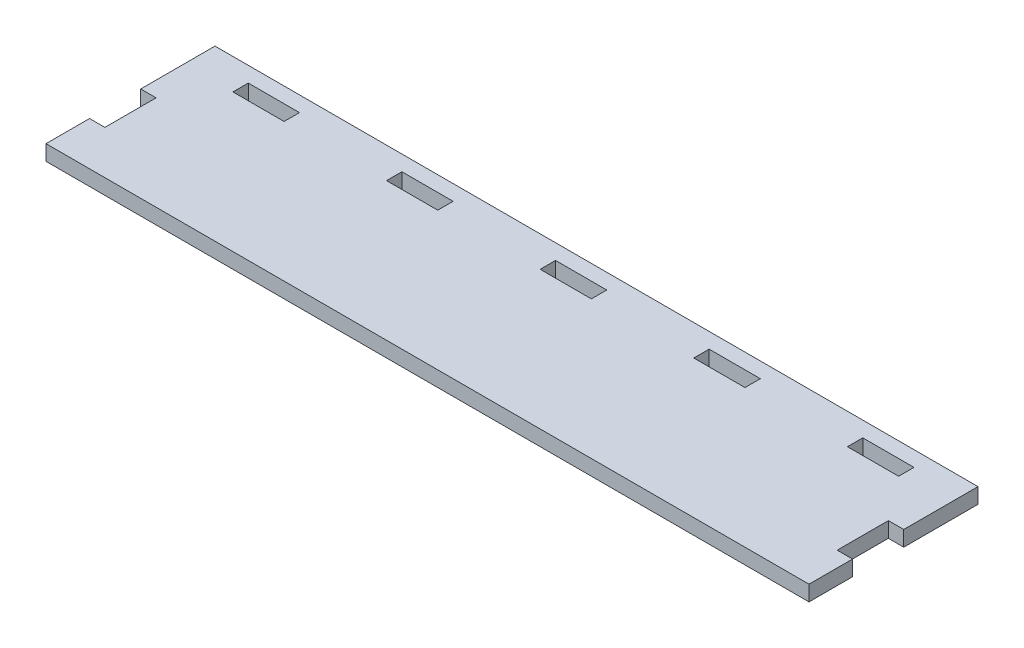
ISO-10303-21;
HEADER;
FILE_DESCRIPTION(('STEP AP214'),'2;1');
FILE_NAME('part.step','',(''),(''),'','','');
FILE_SCHEMA(('AUTOMOTIVE_DESIGN { 1 0 10303 214 1 1 1 1 }'));
ENDSEC;
DATA;
#1=APPLICATION_CONTEXT('core data for automotive mechanical design processes');
#2=APPLICATION_PROTOCOL_DEFINITION('international standard','automotive_design',2000,#1);
#3=PRODUCT_CONTEXT('',#1,'mechanical');
#4=PRODUCT('Part','Part','',(#3));
#5=PRODUCT_RELATED_PRODUCT_CATEGORY('part','',(#4));
#6=PRODUCT_DEFINITION_FORMATION('','',#4);
#7=PRODUCT_DEFINITION_CONTEXT('part definition',#1,'design');
#8=PRODUCT_DEFINITION('design','',#6,#7);
#9=PRODUCT_DEFINITION_SHAPE('','',#8);
#10=(LENGTH_UNIT() NAMED_UNIT(*) SI_UNIT(.MILLI.,.METRE.));
#11=(NAMED_UNIT(*) PLANE_ANGLE_UNIT() SI_UNIT($,.RADIAN.));
#12=(NAMED_UNIT(*) SI_UNIT($,.STERADIAN.) SOLID_ANGLE_UNIT());
#13=UNCERTAINTY_MEASURE_WITH_UNIT(LENGTH_MEASURE(1.E-05),#10,'distance_accuracy_value','');
#14=(GEOMETRIC_REPRESENTATION_CONTEXT(3) GLOBAL_UNCERTAINTY_ASSIGNED_CONTEXT((#13)) GLOBAL_UNIT_ASSIGNED_CONTEXT((#10,
#11,#12)) REPRESENTATION_CONTEXT('',''));
#15=CARTESIAN_POINT('',(0.,0.,0.));
#16=DIRECTION('',(0.,0.,1.));
#17=DIRECTION('',(1.,0.,0.));
#18=AXIS2_PLACEMENT_3D('',#15,#16,#17);
#19=CARTESIAN_POINT('',(0.,3.,0.));
#20=DIRECTION('',(0.,-1.,0.));
#21=DIRECTION('',(0.,0.,-1.));
#22=AXIS2_PLACEMENT_3D('',#19,#20,#21);
#23=PLANE('',#22);
#24=DIRECTION('',(0.,0.,1.));
#25=VECTOR('',#24,1.);
#26=CARTESIAN_POINT('',(55.,3.,3.));
#27=LINE('',#26,#25);
#28=CARTESIAN_POINT('',(55.,3.,3.));
#29=VERTEX_POINT('',#28);
#30=CARTESIAN_POINT('',(55.,3.,6.));
#31=VERTEX_POINT('',#30);
#32=EDGE_CURVE('E278',#29,#31,#27,.T.);
#33=ORIENTED_EDGE('',*,*,#32,.F.);
#34=DIRECTION('',(-1.,0.,0.));
#35=VECTOR('',#34,1.);
#36=CARTESIAN_POINT('',(55.,3.,3.));
#37=LINE('',#36,#35);
#38=CARTESIAN_POINT('',(65.,3.,3.));
#39=VERTEX_POINT('',#38);
#40=EDGE_CURVE('E286',#39,#29,#37,.T.);
#41=ORIENTED_EDGE('',*,*,#40,.F.);
#42=DIRECTION('',(0.,0.,-1.));
#43=VECTOR('',#42,1.);
#44=CARTESIAN_POINT('',(65.,3.,3.));
#45=LINE('',#44,#43);
#46=CARTESIAN_POINT('',(65.,3.,6.));
#47=VERTEX_POINT('',#46);
#48=EDGE_CURVE('E283',#47,#39,#45,.T.);
#49=ORIENTED_EDGE('',*,*,#48,.F.);
#50=DIRECTION('',(1.,0.,0.));
#51=VECTOR('',#50,1.);
#52=CARTESIAN_POINT('',(55.,3.,6.));
#53=LINE('',#52,#51);
#54=EDGE_CURVE('E280',#31,#47,#53,.T.);
#55=ORIENTED_EDGE('',*,*,#54,.F.);
#56=EDGE_LOOP('',(#33,#41,#49,#55));
#57=FACE_BOUND('',#56,.T.);
#58=DIRECTION('',(-1.,0.,0.));
#59=VECTOR('',#58,1.);
#60=CARTESIAN_POINT('',(-55.,3.,3.));
#61=LINE('',#60,#59);
#62=CARTESIAN_POINT('',(-55.,3.,3.));
#63=VERTEX_POINT('',#62);
#64=CARTESIAN_POINT('',(-65.,3.,3.));
#65=VERTEX_POINT('',#64);
#66=EDGE_CURVE('E340',#63,#65,#61,.T.);
#67=ORIENTED_EDGE('',*,*,#66,.F.);
#68=DIRECTION('',(0.,0.,-1.));
#69=VECTOR('',#68,1.);
#70=CARTESIAN_POINT('',(-55.,3.,3.));
#71=LINE('',#70,#69);
#72=CARTESIAN_POINT('',(-55.,3.,6.));
#73=VERTEX_POINT('',#72);
#74=EDGE_CURVE('E348',#73,#63,#71,.T.);
#75=ORIENTED_EDGE('',*,*,#74,.F.);
#76=DIRECTION('',(1.,0.,0.));
#77=VECTOR('',#76,1.);
#78=CARTESIAN_POINT('',(-55.,3.,6.));
#79=LINE('',#78,#77);
#80=CARTESIAN_POINT('',(-65.,3.,6.));
#81=VERTEX_POINT('',#80);
#82=EDGE_CURVE('E345',#81,#73,#79,.T.);
#83=ORIENTED_EDGE('',*,*,#82,.F.);
#84=DIRECTION('',(0.,0.,1.));
#85=VECTOR('',#84,1.);
#86=CARTESIAN_POINT('',(-65.,3.,3.));
#87=LINE('',#86,#85);
#88=EDGE_CURVE('E342',#65,#81,#87,.T.);
#89=ORIENTED_EDGE('',*,*,#88,.F.);
#90=EDGE_LOOP('',(#67,#75,#83,#89));
#91=FACE_BOUND('',#90,.T.);
#92=DIRECTION('',(0.,0.,1.));
#93=VECTOR('',#92,1.);
#94=CARTESIAN_POINT('',(-74.5,3.,0.));
#95=LINE('',#94,#93);
#96=CARTESIAN_POINT('',(-74.5,3.,0.));
#97=VERTEX_POINT('',#96);
#98=CARTESIAN_POINT('',(-74.5,3.,14.5));
#99=VERTEX_POINT('',#98);
#100=EDGE_CURVE('E402',#97,#99,#95,.T.);
#101=ORIENTED_EDGE('',*,*,#100,.T.);
#102=DIRECTION('',(1.,0.,0.));
#103=VECTOR('',#102,1.);
#104=CARTESIAN_POINT('',(-71.5,3.,14.5));
#105=LINE('',#104,#103);
#106=CARTESIAN_POINT('',(-71.5,3.,14.5));
#107=VERTEX_POINT('',#106);
#108=EDGE_CURVE('E405',#99,#107,#105,.T.);
#109=ORIENTED_EDGE('',*,*,#108,.T.);
#110=DIRECTION('',(0.,0.,1.));
#111=VECTOR('',#110,1.);
#112=CARTESIAN_POINT('',(-71.5,3.,14.5));
#113=LINE('',#112,#111);
#114=CARTESIAN_POINT('',(-71.5,3.,24.5));
#115=VERTEX_POINT('',#114);
#116=EDGE_CURVE('E408',#107,#115,#113,.T.);
#117=ORIENTED_EDGE('',*,*,#116,.T.);
#118=DIRECTION('',(-1.,0.,0.));
#119=VECTOR('',#118,1.);
#120=CARTESIAN_POINT('',(-71.5,3.,24.5));
#121=LINE('',#120,#119);
#122=CARTESIAN_POINT('',(-74.5,3.,24.5));
#123=VERTEX_POINT('',#122);
#124=EDGE_CURVE('E410',#115,#123,#121,.T.);
#125=ORIENTED_EDGE('',*,*,#124,.T.);
#126=DIRECTION('',(0.,0.,1.));
#127=VECTOR('',#126,1.);
#128=CARTESIAN_POINT('',(-74.5,3.,24.5));
#129=LINE('',#128,#127);
#130=CARTESIAN_POINT('',(-74.5,3.,33.));
#131=VERTEX_POINT('',#130);
#132=EDGE_CURVE('E412',#123,#131,#129,.T.);
#133=ORIENTED_EDGE('',*,*,#132,.T.);
#134=DIRECTION('',(1.,0.,0.));
#135=VECTOR('',#134,1.);
#136=CARTESIAN_POINT('',(-74.5,3.,33.));
#137=LINE('',#136,#135);
#138=CARTESIAN_POINT('',(74.5,3.,33.));
#139=VERTEX_POINT('',#138);
#140=EDGE_CURVE('E414',#131,#139,#137,.T.);
#141=ORIENTED_EDGE('',*,*,#140,.T.);
#142=DIRECTION('',(0.,0.,-1.));
#143=VECTOR('',#142,1.);
#144=CARTESIAN_POINT('',(74.5,3.,24.5));
#145=LINE('',#144,#143);
#146=CARTESIAN_POINT('',(74.5,3.,24.5));
#147=VERTEX_POINT('',#146);
#148=EDGE_CURVE('E416',#139,#147,#145,.T.);
#149=ORIENTED_EDGE('',*,*,#148,.T.);
#150=DIRECTION('',(-1.,0.,0.));
#151=VECTOR('',#150,1.);
#152=CARTESIAN_POINT('',(71.5,3.,24.5));
#153=LINE('',#152,#151);
#154=CARTESIAN_POINT('',(71.5,3.,24.5));
#155=VERTEX_POINT('',#154);
#156=EDGE_CURVE('E418',#147,#155,#153,.T.);
#157=ORIENTED_EDGE('',*,*,#156,.T.);
#158=DIRECTION('',(0.,0.,-1.));
#159=VECTOR('',#158,1.);
#160=CARTESIAN_POINT('',(71.5,3.,14.5));
#161=LINE('',#160,#159);
#162=CARTESIAN_POINT('',(71.5,3.,14.5));
#163=VERTEX_POINT('',#162);
#164=EDGE_CURVE('E420',#155,#163,#161,.T.);
#165=ORIENTED_EDGE('',*,*,#164,.T.);
#166=DIRECTION('',(1.,0.,0.));
#167=VECTOR('',#166,1.);
#168=CARTESIAN_POINT('',(71.5,3.,14.5));
#169=LINE('',#168,#167);
#170=CARTESIAN_POINT('',(74.5,3.,14.5));
#171=VERTEX_POINT('',#170);
#172=EDGE_CURVE('E422',#163,#171,#169,.T.);
#173=ORIENTED_EDGE('',*,*,#172,.T.);
#174=DIRECTION('',(0.,0.,-1.));
#175=VECTOR('',#174,1.);
#176=CARTESIAN_POINT('',(74.5,3.,0.));
#177=LINE('',#176,#175);
#178=CARTESIAN_POINT('',(74.5,3.,0.));
#179=VERTEX_POINT('',#178);
#180=EDGE_CURVE('E424',#171,#179,#177,.T.);
#181=ORIENTED_EDGE('',*,*,#180,.T.);
#182=DIRECTION('',(-1.,0.,0.));
#183=VECTOR('',#182,1.);
#184=CARTESIAN_POINT('',(-74.5,3.,0.));
#185=LINE('',#184,#183);
#186=EDGE_CURVE('E426',#179,#97,#185,.T.);
#187=ORIENTED_EDGE('',*,*,#186,.T.);
#188=EDGE_LOOP('',(#101,#109,#117,#125,#133,#141,#149,#157,#165,#173,#181,#187));
#189=FACE_BOUND('',#188,.T.);
#190=DIRECTION('',(0.,0.,1.));
#191=VECTOR('',#190,1.);
#192=CARTESIAN_POINT('',(-5.,3.,3.));
#193=LINE('',#192,#191);
#194=CARTESIAN_POINT('',(-5.,3.,3.));
#195=VERTEX_POINT('',#194);
#196=CARTESIAN_POINT('',(-5.,3.,6.));
#197=VERTEX_POINT('',#196);
#198=EDGE_CURVE('E371',#195,#197,#193,.T.);
#199=ORIENTED_EDGE('',*,*,#198,.F.);
#200=DIRECTION('',(-1.,0.,0.));
#201=VECTOR('',#200,1.);
#202=CARTESIAN_POINT('',(-5.,3.,3.));
#203=LINE('',#202,#201);
#204=CARTESIAN_POINT('',(5.,3.,3.));
#205=VERTEX_POINT('',#204);
#206=EDGE_CURVE('E379',#205,#195,#203,.T.);
#207=ORIENTED_EDGE('',*,*,#206,.F.);
#208=DIRECTION('',(0.,0.,-1.));
#209=VECTOR('',#208,1.);
#210=CARTESIAN_POINT('',(5.,3.,3.));
#211=LINE('',#210,#209);
#212=CARTESIAN_POINT('',(5.,3.,6.));
#213=VERTEX_POINT('',#212);
#214=EDGE_CURVE('E376',#213,#205,#211,.T.);
#215=ORIENTED_EDGE('',*,*,#214,.F.);
#216=DIRECTION('',(1.,0.,0.));
#217=VECTOR('',#216,1.);
#218=CARTESIAN_POINT('',(-5.,3.,6.));
#219=LINE('',#218,#217);
#220=EDGE_CURVE('E373',#197,#213,#219,.T.);
#221=ORIENTED_EDGE('',*,*,#220,.F.);
#222=EDGE_LOOP('',(#199,#207,#215,#221));
#223=FACE_BOUND('',#222,.T.);
#224=DIRECTION('',(0.,0.,1.));
#225=VECTOR('',#224,1.);
#226=CARTESIAN_POINT('',(25.,3.,3.));
#227=LINE('',#226,#225);
#228=CARTESIAN_POINT('',(25.,3.,3.));
#229=VERTEX_POINT('',#228);
#230=CARTESIAN_POINT('',(25.,3.,6.));
#231=VERTEX_POINT('',#230);
#232=EDGE_CURVE('E309',#229,#231,#227,.T.);
#233=ORIENTED_EDGE('',*,*,#232,.F.);
#234=DIRECTION('',(-1.,0.,0.));
#235=VECTOR('',#234,1.);
#236=CARTESIAN_POINT('',(25.,3.,3.));
#237=LINE('',#236,#235);
#238=CARTESIAN_POINT('',(35.,3.,3.));
#239=VERTEX_POINT('',#238);
#240=EDGE_CURVE('E317',#239,#229,#237,.T.);
#241=ORIENTED_EDGE('',*,*,#240,.F.);
#242=DIRECTION('',(0.,0.,-1.));
#243=VECTOR('',#242,1.);
#244=CARTESIAN_POINT('',(35.,3.,3.));
#245=LINE('',#244,#243);
#246=CARTESIAN_POINT('',(35.,3.,6.));
#247=VERTEX_POINT('',#246);
#248=EDGE_CURVE('E314',#247,#239,#245,.T.);
#249=ORIENTED_EDGE('',*,*,#248,.F.);
#250=DIRECTION('',(1.,0.,0.));
#251=VECTOR('',#250,1.);
#252=CARTESIAN_POINT('',(25.,3.,6.));
#253=LINE('',#252,#251);
#254=EDGE_CURVE('E311',#231,#247,#253,.T.);
#255=ORIENTED_EDGE('',*,*,#254,.F.);
#256=EDGE_LOOP('',(#233,#241,#249,#255));
#257=FACE_BOUND('',#256,.T.);
#258=DIRECTION('',(-1.,0.,0.));
#259=VECTOR('',#258,1.);
#260=CARTESIAN_POINT('',(-25.,3.,3.));
#261=LINE('',#260,#259);
#262=CARTESIAN_POINT('',(-25.,3.,3.));
#263=VERTEX_POINT('',#262);
#264=CARTESIAN_POINT('',(-35.,3.,3.));
#265=VERTEX_POINT('',#264);
#266=EDGE_CURVE('E242',#263,#265,#261,.T.);
#267=ORIENTED_EDGE('',*,*,#266,.F.);
#268=DIRECTION('',(0.,0.,-1.));
#269=VECTOR('',#268,1.);
#270=CARTESIAN_POINT('',(-25.,3.,3.));
#271=LINE('',#270,#269);
#272=CARTESIAN_POINT('',(-25.,3.,6.));
#273=VERTEX_POINT('',#272);
#274=EDGE_CURVE('E264',#273,#263,#271,.T.);
#275=ORIENTED_EDGE('',*,*,#274,.F.);
#276=DIRECTION('',(1.,0.,0.));
#277=VECTOR('',#276,1.);
#278=CARTESIAN_POINT('',(-25.,3.,6.));
#279=LINE('',#278,#277);
#280=CARTESIAN_POINT('',(-35.,3.,6.));
#281=VERTEX_POINT('',#280);
#282=EDGE_CURVE('E262',#281,#273,#279,.T.);
#283=ORIENTED_EDGE('',*,*,#282,.F.);
#284=DIRECTION('',(0.,0.,1.));
#285=VECTOR('',#284,1.);
#286=CARTESIAN_POINT('',(-35.,3.,3.));
#287=LINE('',#286,#285);
#288=EDGE_CURVE('E250',#265,#281,#287,.T.);
#289=ORIENTED_EDGE('',*,*,#288,.F.);
#290=EDGE_LOOP('',(#267,#275,#283,#289));
#291=FACE_BOUND('',#290,.T.);
#292=ADVANCED_FACE('F33',(#57,#91,#189,#223,#257,#291),#23,.F.);
#293=CARTESIAN_POINT('',(0.,0.,0.));
#294=DIRECTION('',(0.,-1.,0.));
#295=DIRECTION('',(0.,0.,-1.));
#296=AXIS2_PLACEMENT_3D('',#293,#294,#295);
#297=PLANE('',#296);
#298=DIRECTION('',(0.,0.,1.));
#299=VECTOR('',#298,1.);
#300=CARTESIAN_POINT('',(-74.5,0.,0.));
#301=LINE('',#300,#299);
#302=CARTESIAN_POINT('',(-74.5,0.,0.));
#303=VERTEX_POINT('',#302);
#304=CARTESIAN_POINT('',(-74.5,0.,14.5));
#305=VERTEX_POINT('',#304);
#306=EDGE_CURVE('E401',#303,#305,#301,.T.);
#307=ORIENTED_EDGE('',*,*,#306,.F.);
#308=DIRECTION('',(-1.,0.,0.));
#309=VECTOR('',#308,1.);
#310=CARTESIAN_POINT('',(-74.5,0.,0.));
#311=LINE('',#310,#309);
#312=CARTESIAN_POINT('',(74.5,0.,0.));
#313=VERTEX_POINT('',#312);
#314=EDGE_CURVE('E406',#313,#303,#311,.T.);
#315=ORIENTED_EDGE('',*,*,#314,.F.);
#316=DIRECTION('',(0.,0.,-1.));
#317=VECTOR('',#316,1.);
#318=CARTESIAN_POINT('',(74.5,0.,0.));
#319=LINE('',#318,#317);
#320=CARTESIAN_POINT('',(74.5,0.,14.5));
#321=VERTEX_POINT('',#320);
#322=EDGE_CURVE('E449',#321,#313,#319,.T.);
#323=ORIENTED_EDGE('',*,*,#322,.F.);
#324=DIRECTION('',(1.,0.,0.));
#325=VECTOR('',#324,1.);
#326=CARTESIAN_POINT('',(71.5,0.,14.5));
#327=LINE('',#326,#325);
#328=CARTESIAN_POINT('',(71.5,0.,14.5));
#329=VERTEX_POINT('',#328);
#330=EDGE_CURVE('E447',#329,#321,#327,.T.);
#331=ORIENTED_EDGE('',*,*,#330,.F.);
#332=DIRECTION('',(0.,0.,-1.));
#333=VECTOR('',#332,1.);
#334=CARTESIAN_POINT('',(71.5,0.,14.5));
#335=LINE('',#334,#333);
#336=CARTESIAN_POINT('',(71.5,0.,24.5));
#337=VERTEX_POINT('',#336);
#338=EDGE_CURVE('E445',#337,#329,#335,.T.);
#339=ORIENTED_EDGE('',*,*,#338,.F.);
#340=DIRECTION('',(-1.,0.,0.));
#341=VECTOR('',#340,1.);
#342=CARTESIAN_POINT('',(71.5,0.,24.5));
#343=LINE('',#342,#341);
#344=CARTESIAN_POINT('',(74.5,0.,24.5));
#345=VERTEX_POINT('',#344);
#346=EDGE_CURVE('E443',#345,#337,#343,.T.);
#347=ORIENTED_EDGE('',*,*,#346,.F.);
#348=DIRECTION('',(0.,0.,-1.));
#349=VECTOR('',#348,1.);
#350=CARTESIAN_POINT('',(74.5,0.,24.5));
#351=LINE('',#350,#349);
#352=CARTESIAN_POINT('',(74.5,0.,33.));
#353=VERTEX_POINT('',#352);
#354=EDGE_CURVE('E441',#353,#345,#351,.T.);
#355=ORIENTED_EDGE('',*,*,#354,.F.);
#356=DIRECTION('',(1.,0.,0.));
#357=VECTOR('',#356,1.);
#358=CARTESIAN_POINT('',(-74.5,0.,33.));
#359=LINE('',#358,#357);
#360=CARTESIAN_POINT('',(-74.5,0.,33.));
#361=VERTEX_POINT('',#360);
#362=EDGE_CURVE('E439',#361,#353,#359,.T.);
#363=ORIENTED_EDGE('',*,*,#362,.F.);
#364=DIRECTION('',(0.,0.,1.));
#365=VECTOR('',#364,1.);
#366=CARTESIAN_POINT('',(-74.5,0.,24.5));
#367=LINE('',#366,#365);
#368=CARTESIAN_POINT('',(-74.5,0.,24.5));
#369=VERTEX_POINT('',#368);
#370=EDGE_CURVE('E437',#369,#361,#367,.T.);
#371=ORIENTED_EDGE('',*,*,#370,.F.);
#372=DIRECTION('',(-1.,0.,0.));
#373=VECTOR('',#372,1.);
#374=CARTESIAN_POINT('',(-71.5,0.,24.5));
#375=LINE('',#374,#373);
#376=CARTESIAN_POINT('',(-71.5,0.,24.5));
#377=VERTEX_POINT('',#376);
#378=EDGE_CURVE('E435',#377,#369,#375,.T.);
#379=ORIENTED_EDGE('',*,*,#378,.F.);
#380=DIRECTION('',(0.,0.,1.));
#381=VECTOR('',#380,1.);
#382=CARTESIAN_POINT('',(-71.5,0.,14.5));
#383=LINE('',#382,#381);
#384=CARTESIAN_POINT('',(-71.5,0.,14.5));
#385=VERTEX_POINT('',#384);
#386=EDGE_CURVE('E433',#385,#377,#383,.T.);
#387=ORIENTED_EDGE('',*,*,#386,.F.);
#388=DIRECTION('',(1.,0.,0.));
#389=VECTOR('',#388,1.);
#390=CARTESIAN_POINT('',(-71.5,0.,14.5));
#391=LINE('',#390,#389);
#392=EDGE_CURVE('E431',#305,#385,#391,.T.);
#393=ORIENTED_EDGE('',*,*,#392,.F.);
#394=EDGE_LOOP('',(#307,#315,#323,#331,#339,#347,#355,#363,#371,#379,#387,#393));
#395=FACE_BOUND('',#394,.T.);
#396=DIRECTION('',(-1.,0.,0.));
#397=VECTOR('',#396,1.);
#398=CARTESIAN_POINT('',(-5.,0.,3.));
#399=LINE('',#398,#397);
#400=CARTESIAN_POINT('',(5.,0.,3.));
#401=VERTEX_POINT('',#400);
#402=CARTESIAN_POINT('',(-5.,0.,3.));
#403=VERTEX_POINT('',#402);
#404=EDGE_CURVE('E374',#401,#403,#399,.T.);
#405=ORIENTED_EDGE('',*,*,#404,.T.);
#406=DIRECTION('',(0.,0.,1.));
#407=VECTOR('',#406,1.);
#408=CARTESIAN_POINT('',(-5.,0.,3.));
#409=LINE('',#408,#407);
#410=CARTESIAN_POINT('',(-5.,0.,6.));
#411=VERTEX_POINT('',#410);
#412=EDGE_CURVE('E370',#403,#411,#409,.T.);
#413=ORIENTED_EDGE('',*,*,#412,.T.);
#414=DIRECTION('',(1.,0.,0.));
#415=VECTOR('',#414,1.);
#416=CARTESIAN_POINT('',(-5.,0.,6.));
#417=LINE('',#416,#415);
#418=CARTESIAN_POINT('',(5.,0.,6.));
#419=VERTEX_POINT('',#418);
#420=EDGE_CURVE('E384',#411,#419,#417,.T.);
#421=ORIENTED_EDGE('',*,*,#420,.T.);
#422=DIRECTION('',(0.,0.,-1.));
#423=VECTOR('',#422,1.);
#424=CARTESIAN_POINT('',(5.,0.,3.));
#425=LINE('',#424,#423);
#426=EDGE_CURVE('E387',#419,#401,#425,.T.);
#427=ORIENTED_EDGE('',*,*,#426,.T.);
#428=EDGE_LOOP('',(#405,#413,#421,#427));
#429=FACE_BOUND('',#428,.T.);
#430=DIRECTION('',(0.,0.,-1.));
#431=VECTOR('',#430,1.);
#432=CARTESIAN_POINT('',(-55.,0.,3.));
#433=LINE('',#432,#431);
#434=CARTESIAN_POINT('',(-55.,0.,6.));
#435=VERTEX_POINT('',#434);
#436=CARTESIAN_POINT('',(-55.,0.,3.));
#437=VERTEX_POINT('',#436);
#438=EDGE_CURVE('E343',#435,#437,#433,.T.);
#439=ORIENTED_EDGE('',*,*,#438,.T.);
#440=DIRECTION('',(-1.,0.,0.));
#441=VECTOR('',#440,1.);
#442=CARTESIAN_POINT('',(-55.,0.,3.));
#443=LINE('',#442,#441);
#444=CARTESIAN_POINT('',(-65.,0.,3.));
#445=VERTEX_POINT('',#444);
#446=EDGE_CURVE('E339',#437,#445,#443,.T.);
#447=ORIENTED_EDGE('',*,*,#446,.T.);
#448=DIRECTION('',(0.,0.,1.));
#449=VECTOR('',#448,1.);
#450=CARTESIAN_POINT('',(-65.,0.,3.));
#451=LINE('',#450,#449);
#452=CARTESIAN_POINT('',(-65.,0.,6.));
#453=VERTEX_POINT('',#452);
#454=EDGE_CURVE('E353',#445,#453,#451,.T.);
#455=ORIENTED_EDGE('',*,*,#454,.T.);
#456=DIRECTION('',(1.,0.,0.));
#457=VECTOR('',#456,1.);
#458=CARTESIAN_POINT('',(-55.,0.,6.));
#459=LINE('',#458,#457);
#460=EDGE_CURVE('E356',#453,#435,#459,.T.);
#461=ORIENTED_EDGE('',*,*,#460,.T.);
#462=EDGE_LOOP('',(#439,#447,#455,#461));
#463=FACE_BOUND('',#462,.T.);
#464=DIRECTION('',(-1.,0.,0.));
#465=VECTOR('',#464,1.);
#466=CARTESIAN_POINT('',(25.,0.,3.));
#467=LINE('',#466,#465);
#468=CARTESIAN_POINT('',(35.,0.,3.));
#469=VERTEX_POINT('',#468);
#470=CARTESIAN_POINT('',(25.,0.,3.));
#471=VERTEX_POINT('',#470);
#472=EDGE_CURVE('E312',#469,#471,#467,.T.);
#473=ORIENTED_EDGE('',*,*,#472,.T.);
#474=DIRECTION('',(0.,0.,1.));
#475=VECTOR('',#474,1.);
#476=CARTESIAN_POINT('',(25.,0.,3.));
#477=LINE('',#476,#475);
#478=CARTESIAN_POINT('',(25.,0.,6.));
#479=VERTEX_POINT('',#478);
#480=EDGE_CURVE('E308',#471,#479,#477,.T.);
#481=ORIENTED_EDGE('',*,*,#480,.T.);
#482=DIRECTION('',(1.,0.,0.));
#483=VECTOR('',#482,1.);
#484=CARTESIAN_POINT('',(25.,0.,6.));
#485=LINE('',#484,#483);
#486=CARTESIAN_POINT('',(35.,0.,6.));
#487=VERTEX_POINT('',#486);
#488=EDGE_CURVE('E322',#479,#487,#485,.T.);
#489=ORIENTED_EDGE('',*,*,#488,.T.);
#490=DIRECTION('',(0.,0.,-1.));
#491=VECTOR('',#490,1.);
#492=CARTESIAN_POINT('',(35.,0.,3.));
#493=LINE('',#492,#491);
#494=EDGE_CURVE('E325',#487,#469,#493,.T.);
#495=ORIENTED_EDGE('',*,*,#494,.T.);
#496=EDGE_LOOP('',(#473,#481,#489,#495));
#497=FACE_BOUND('',#496,.T.);
#498=DIRECTION('',(-1.,0.,0.));
#499=VECTOR('',#498,1.);
#500=CARTESIAN_POINT('',(55.,0.,3.));
#501=LINE('',#500,#499);
#502=CARTESIAN_POINT('',(65.,0.,3.));
#503=VERTEX_POINT('',#502);
#504=CARTESIAN_POINT('',(55.,0.,3.));
#505=VERTEX_POINT('',#504);
#506=EDGE_CURVE('E281',#503,#505,#501,.T.);
#507=ORIENTED_EDGE('',*,*,#506,.T.);
#508=DIRECTION('',(0.,0.,1.));
#509=VECTOR('',#508,1.);
#510=CARTESIAN_POINT('',(55.,0.,3.));
#511=LINE('',#510,#509);
#512=CARTESIAN_POINT('',(55.,0.,6.));
#513=VERTEX_POINT('',#512);
#514=EDGE_CURVE('E258',#505,#513,#511,.T.);
#515=ORIENTED_EDGE('',*,*,#514,.T.);
#516=DIRECTION('',(1.,0.,0.));
#517=VECTOR('',#516,1.);
#518=CARTESIAN_POINT('',(55.,0.,6.));
#519=LINE('',#518,#517);
#520=CARTESIAN_POINT('',(65.,0.,6.));
#521=VERTEX_POINT('',#520);
#522=EDGE_CURVE('E291',#513,#521,#519,.T.);
#523=ORIENTED_EDGE('',*,*,#522,.T.);
#524=DIRECTION('',(0.,0.,-1.));
#525=VECTOR('',#524,1.);
#526=CARTESIAN_POINT('',(65.,0.,3.));
#527=LINE('',#526,#525);
#528=EDGE_CURVE('E294',#521,#503,#527,.T.);
#529=ORIENTED_EDGE('',*,*,#528,.T.);
#530=EDGE_LOOP('',(#507,#515,#523,#529));
#531=FACE_BOUND('',#530,.T.);
#532=DIRECTION('',(0.,0.,-1.));
#533=VECTOR('',#532,1.);
#534=CARTESIAN_POINT('',(-25.,0.,3.));
#535=LINE('',#534,#533);
#536=CARTESIAN_POINT('',(-25.,0.,6.));
#537=VERTEX_POINT('',#536);
#538=CARTESIAN_POINT('',(-25.,0.,3.));
#539=VERTEX_POINT('',#538);
#540=EDGE_CURVE('E251',#537,#539,#535,.T.);
#541=ORIENTED_EDGE('',*,*,#540,.T.);
#542=DIRECTION('',(-1.,0.,0.));
#543=VECTOR('',#542,1.);
#544=CARTESIAN_POINT('',(-25.,0.,3.));
#545=LINE('',#544,#543);
#546=CARTESIAN_POINT('',(-35.,0.,3.));
#547=VERTEX_POINT('',#546);
#548=EDGE_CURVE('E56',#539,#547,#545,.T.);
#549=ORIENTED_EDGE('',*,*,#548,.T.);
#550=DIRECTION('',(0.,0.,1.));
#551=VECTOR('',#550,1.);
#552=CARTESIAN_POINT('',(-35.,0.,3.));
#553=LINE('',#552,#551);
#554=CARTESIAN_POINT('',(-35.,0.,6.));
#555=VERTEX_POINT('',#554);
#556=EDGE_CURVE('E257',#547,#555,#553,.T.);
#557=ORIENTED_EDGE('',*,*,#556,.T.);
#558=DIRECTION('',(1.,0.,0.));
#559=VECTOR('',#558,1.);
#560=CARTESIAN_POINT('',(-25.,0.,6.));
#561=LINE('',#560,#559);
#562=EDGE_CURVE('E270',#555,#537,#561,.T.);
#563=ORIENTED_EDGE('',*,*,#562,.T.);
#564=EDGE_LOOP('',(#541,#549,#557,#563));
#565=FACE_BOUND('',#564,.T.);
#566=ADVANCED_FACE('F491',(#395,#429,#463,#497,#531,#565),#297,.T.);
#567=CARTESIAN_POINT('',(-74.5,3.,0.));
#568=DIRECTION('',(1.,0.,0.));
#569=DIRECTION('',(0.,0.,-1.));
#570=AXIS2_PLACEMENT_3D('',#567,#568,#569);
#571=PLANE('',#570);
#572=ORIENTED_EDGE('',*,*,#306,.T.);
#573=DIRECTION('',(0.,-1.,0.));
#574=VECTOR('',#573,1.);
#575=CARTESIAN_POINT('',(-74.5,3.,14.5));
#576=LINE('',#575,#574);
#577=EDGE_CURVE('E11',#99,#305,#576,.T.);
#578=ORIENTED_EDGE('',*,*,#577,.F.);
#579=ORIENTED_EDGE('',*,*,#100,.F.);
#580=DIRECTION('',(0.,-1.,0.));
#581=VECTOR('',#580,1.);
#582=CARTESIAN_POINT('',(-74.5,3.,0.));
#583=LINE('',#582,#581);
#584=EDGE_CURVE('E428',#97,#303,#583,.T.);
#585=ORIENTED_EDGE('',*,*,#584,.T.);
#586=EDGE_LOOP('',(#572,#578,#579,#585));
#587=FACE_BOUND('',#586,.T.);
#588=ADVANCED_FACE('F35',(#587),#571,.F.);
#589=CARTESIAN_POINT('',(-71.5,3.,14.5));
#590=DIRECTION('',(0.,0.,-1.));
#591=DIRECTION('',(-1.,0.,0.));
#592=AXIS2_PLACEMENT_3D('',#589,#590,#591);
#593=PLANE('',#592);
#594=ORIENTED_EDGE('',*,*,#392,.T.);
#595=DIRECTION('',(0.,-1.,0.));
#596=VECTOR('',#595,1.);
#597=CARTESIAN_POINT('',(-71.5,3.,14.5));
#598=LINE('',#597,#596);
#599=EDGE_CURVE('E41',#107,#385,#598,.T.);
#600=ORIENTED_EDGE('',*,*,#599,.F.);
#601=ORIENTED_EDGE('',*,*,#108,.F.);
#602=ORIENTED_EDGE('',*,*,#577,.T.);
#603=EDGE_LOOP('',(#594,#600,#601,#602));
#604=FACE_BOUND('',#603,.T.);
#605=ADVANCED_FACE('F509',(#604),#593,.F.);
#606=CARTESIAN_POINT('',(-71.5,3.,14.5));
#607=DIRECTION('',(1.,0.,0.));
#608=DIRECTION('',(0.,0.,-1.));
#609=AXIS2_PLACEMENT_3D('',#606,#607,#608);
#610=PLANE('',#609);
#611=ORIENTED_EDGE('',*,*,#386,.T.);
#612=DIRECTION('',(0.,-1.,0.));
#613=VECTOR('',#612,1.);
#614=CARTESIAN_POINT('',(-71.5,3.,24.5));
#615=LINE('',#614,#613);
#616=EDGE_CURVE('E478',#115,#377,#615,.T.);
#617=ORIENTED_EDGE('',*,*,#616,.F.);
#618=ORIENTED_EDGE('',*,*,#116,.F.);
#619=ORIENTED_EDGE('',*,*,#599,.T.);
#620=EDGE_LOOP('',(#611,#617,#618,#619));
#621=FACE_BOUND('',#620,.T.);
#622=ADVANCED_FACE('F485',(#621),#610,.F.);
#623=CARTESIAN_POINT('',(-71.5,3.,24.5));
#624=DIRECTION('',(0.,0.,1.));
#625=DIRECTION('',(1.,0.,0.));
#626=AXIS2_PLACEMENT_3D('',#623,#624,#625);
#627=PLANE('',#626);
#628=ORIENTED_EDGE('',*,*,#378,.T.);
#629=DIRECTION('',(0.,-1.,0.));
#630=VECTOR('',#629,1.);
#631=CARTESIAN_POINT('',(-74.5,3.,24.5));
#632=LINE('',#631,#630);
#633=EDGE_CURVE('E475',#123,#369,#632,.T.);
#634=ORIENTED_EDGE('',*,*,#633,.F.);
#635=ORIENTED_EDGE('',*,*,#124,.F.);
#636=ORIENTED_EDGE('',*,*,#616,.T.);
#637=EDGE_LOOP('',(#628,#634,#635,#636));
#638=FACE_BOUND('',#637,.T.);
#639=ADVANCED_FACE('F497',(#638),#627,.F.);
#640=CARTESIAN_POINT('',(-74.5,3.,24.5));
#641=DIRECTION('',(1.,0.,0.));
#642=DIRECTION('',(0.,0.,-1.));
#643=AXIS2_PLACEMENT_3D('',#640,#641,#642);
#644=PLANE('',#643);
#645=ORIENTED_EDGE('',*,*,#370,.T.);
#646=DIRECTION('',(0.,-1.,0.));
#647=VECTOR('',#646,1.);
#648=CARTESIAN_POINT('',(-74.5,3.,33.));
#649=LINE('',#648,#647);
#650=EDGE_CURVE('E472',#131,#361,#649,.T.);
#651=ORIENTED_EDGE('',*,*,#650,.F.);
#652=ORIENTED_EDGE('',*,*,#132,.F.);
#653=ORIENTED_EDGE('',*,*,#633,.T.);
#654=EDGE_LOOP('',(#645,#651,#652,#653));
#655=FACE_BOUND('',#654,.T.);
#656=ADVANCED_FACE('F501',(#655),#644,.F.);
#657=CARTESIAN_POINT('',(-74.5,3.,33.));
#658=DIRECTION('',(0.,0.,-1.));
#659=DIRECTION('',(-1.,0.,0.));
#660=AXIS2_PLACEMENT_3D('',#657,#658,#659);
#661=PLANE('',#660);
#662=ORIENTED_EDGE('',*,*,#362,.T.);
#663=DIRECTION('',(0.,-1.,0.));
#664=VECTOR('',#663,1.);
#665=CARTESIAN_POINT('',(74.5,3.,33.));
#666=LINE('',#665,#664);
#667=EDGE_CURVE('E469',#139,#353,#666,.T.);
#668=ORIENTED_EDGE('',*,*,#667,.F.);
#669=ORIENTED_EDGE('',*,*,#140,.F.);
#670=ORIENTED_EDGE('',*,*,#650,.T.);
#671=EDGE_LOOP('',(#662,#668,#669,#670));
#672=FACE_BOUND('',#671,.T.);
#673=ADVANCED_FACE('F542',(#672),#661,.F.);
#674=CARTESIAN_POINT('',(74.5,3.,24.5));
#675=DIRECTION('',(-1.,0.,0.));
#676=DIRECTION('',(0.,0.,1.));
#677=AXIS2_PLACEMENT_3D('',#674,#675,#676);
#678=PLANE('',#677);
#679=ORIENTED_EDGE('',*,*,#354,.T.);
#680=DIRECTION('',(0.,-1.,0.));
#681=VECTOR('',#680,1.);
#682=CARTESIAN_POINT('',(74.5,3.,24.5));
#683=LINE('',#682,#681);
#684=EDGE_CURVE('E466',#147,#345,#683,.T.);
#685=ORIENTED_EDGE('',*,*,#684,.F.);
#686=ORIENTED_EDGE('',*,*,#148,.F.);
#687=ORIENTED_EDGE('',*,*,#667,.T.);
#688=EDGE_LOOP('',(#679,#685,#686,#687));
#689=FACE_BOUND('',#688,.T.);
#690=ADVANCED_FACE('F540',(#689),#678,.F.);
#691=CARTESIAN_POINT('',(71.5,3.,24.5));
#692=DIRECTION('',(0.,0.,1.));
#693=DIRECTION('',(1.,0.,0.));
#694=AXIS2_PLACEMENT_3D('',#691,#692,#693);
#695=PLANE('',#694);
#696=ORIENTED_EDGE('',*,*,#346,.T.);
#697=DIRECTION('',(0.,-1.,0.));
#698=VECTOR('',#697,1.);
#699=CARTESIAN_POINT('',(71.5,3.,24.5));
#700=LINE('',#699,#698);
#701=EDGE_CURVE('E463',#155,#337,#700,.T.);
#702=ORIENTED_EDGE('',*,*,#701,.F.);
#703=ORIENTED_EDGE('',*,*,#156,.F.);
#704=ORIENTED_EDGE('',*,*,#684,.T.);
#705=EDGE_LOOP('',(#696,#702,#703,#704));
#706=FACE_BOUND('',#705,.T.);
#707=ADVANCED_FACE('F536',(#706),#695,.F.);
#708=CARTESIAN_POINT('',(71.5,3.,14.5));
#709=DIRECTION('',(-1.,0.,0.));
#710=DIRECTION('',(0.,0.,1.));
#711=AXIS2_PLACEMENT_3D('',#708,#709,#710);
#712=PLANE('',#711);
#713=ORIENTED_EDGE('',*,*,#338,.T.);
#714=DIRECTION('',(0.,-1.,0.));
#715=VECTOR('',#714,1.);
#716=CARTESIAN_POINT('',(71.5,3.,14.5));
#717=LINE('',#716,#715);
#718=EDGE_CURVE('E460',#163,#329,#717,.T.);
#719=ORIENTED_EDGE('',*,*,#718,.F.);
#720=ORIENTED_EDGE('',*,*,#164,.F.);
#721=ORIENTED_EDGE('',*,*,#701,.T.);
#722=EDGE_LOOP('',(#713,#719,#720,#721));
#723=FACE_BOUND('',#722,.T.);
#724=ADVANCED_FACE('F531',(#723),#712,.F.);
#725=CARTESIAN_POINT('',(71.5,3.,14.5));
#726=DIRECTION('',(0.,0.,-1.));
#727=DIRECTION('',(-1.,0.,0.));
#728=AXIS2_PLACEMENT_3D('',#725,#726,#727);
#729=PLANE('',#728);
#730=ORIENTED_EDGE('',*,*,#330,.T.);
#731=DIRECTION('',(0.,-1.,0.));
#732=VECTOR('',#731,1.);
#733=CARTESIAN_POINT('',(74.5,3.,14.5));
#734=LINE('',#733,#732);
#735=EDGE_CURVE('E457',#171,#321,#734,.T.);
#736=ORIENTED_EDGE('',*,*,#735,.F.);
#737=ORIENTED_EDGE('',*,*,#172,.F.);
#738=ORIENTED_EDGE('',*,*,#718,.T.);
#739=EDGE_LOOP('',(#730,#736,#737,#738));
#740=FACE_BOUND('',#739,.T.);
#741=ADVANCED_FACE('F525',(#740),#729,.F.);
#742=CARTESIAN_POINT('',(74.5,3.,0.));
#743=DIRECTION('',(-1.,0.,0.));
#744=DIRECTION('',(0.,0.,1.));
#745=AXIS2_PLACEMENT_3D('',#742,#743,#744);
#746=PLANE('',#745);
#747=ORIENTED_EDGE('',*,*,#322,.T.);
#748=DIRECTION('',(0.,-1.,0.));
#749=VECTOR('',#748,1.);
#750=CARTESIAN_POINT('',(74.5,3.,0.));
#751=LINE('',#750,#749);
#752=EDGE_CURVE('E454',#179,#313,#751,.T.);
#753=ORIENTED_EDGE('',*,*,#752,.F.);
#754=ORIENTED_EDGE('',*,*,#180,.F.);
#755=ORIENTED_EDGE('',*,*,#735,.T.);
#756=EDGE_LOOP('',(#747,#753,#754,#755));
#757=FACE_BOUND('',#756,.T.);
#758=ADVANCED_FACE('F521',(#757),#746,.F.);
#759=CARTESIAN_POINT('',(-74.5,3.,0.));
#760=DIRECTION('',(0.,0.,1.));
#761=DIRECTION('',(1.,0.,0.));
#762=AXIS2_PLACEMENT_3D('',#759,#760,#761);
#763=PLANE('',#762);
#764=ORIENTED_EDGE('',*,*,#314,.T.);
#765=ORIENTED_EDGE('',*,*,#584,.F.);
#766=ORIENTED_EDGE('',*,*,#186,.F.);
#767=ORIENTED_EDGE('',*,*,#752,.T.);
#768=EDGE_LOOP('',(#764,#765,#766,#767));
#769=FACE_BOUND('',#768,.T.);
#770=ADVANCED_FACE('F516',(#769),#763,.F.);
#771=CARTESIAN_POINT('',(-5.,3.,3.));
#772=DIRECTION('',(1.,0.,0.));
#773=DIRECTION('',(0.,0.,-1.));
#774=AXIS2_PLACEMENT_3D('',#771,#772,#773);
#775=PLANE('',#774);
#776=ORIENTED_EDGE('',*,*,#412,.F.);
#777=DIRECTION('',(0.,-1.,0.));
#778=VECTOR('',#777,1.);
#779=CARTESIAN_POINT('',(-5.,3.,3.));
#780=LINE('',#779,#778);
#781=EDGE_CURVE('E381',#195,#403,#780,.T.);
#782=ORIENTED_EDGE('',*,*,#781,.F.);
#783=ORIENTED_EDGE('',*,*,#198,.T.);
#784=DIRECTION('',(0.,-1.,0.));
#785=VECTOR('',#784,1.);
#786=CARTESIAN_POINT('',(-5.,3.,6.));
#787=LINE('',#786,#785);
#788=EDGE_CURVE('E398',#197,#411,#787,.T.);
#789=ORIENTED_EDGE('',*,*,#788,.T.);
#790=EDGE_LOOP('',(#776,#782,#783,#789));
#791=FACE_BOUND('',#790,.T.);
#792=ADVANCED_FACE('F561',(#791),#775,.T.);
#793=CARTESIAN_POINT('',(-5.,3.,6.));
#794=DIRECTION('',(0.,0.,-1.));
#795=DIRECTION('',(-1.,0.,0.));
#796=AXIS2_PLACEMENT_3D('',#793,#794,#795);
#797=PLANE('',#796);
#798=ORIENTED_EDGE('',*,*,#420,.F.);
#799=ORIENTED_EDGE('',*,*,#788,.F.);
#800=ORIENTED_EDGE('',*,*,#220,.T.);
#801=DIRECTION('',(0.,-1.,0.));
#802=VECTOR('',#801,1.);
#803=CARTESIAN_POINT('',(5.,3.,6.));
#804=LINE('',#803,#802);
#805=EDGE_CURVE('E396',#213,#419,#804,.T.);
#806=ORIENTED_EDGE('',*,*,#805,.T.);
#807=EDGE_LOOP('',(#798,#799,#800,#806));
#808=FACE_BOUND('',#807,.T.);
#809=ADVANCED_FACE('F599',(#808),#797,.T.);
#810=CARTESIAN_POINT('',(5.,3.,3.));
#811=DIRECTION('',(-1.,0.,0.));
#812=DIRECTION('',(0.,0.,1.));
#813=AXIS2_PLACEMENT_3D('',#810,#811,#812);
#814=PLANE('',#813);
#815=ORIENTED_EDGE('',*,*,#426,.F.);
#816=ORIENTED_EDGE('',*,*,#805,.F.);
#817=ORIENTED_EDGE('',*,*,#214,.T.);
#818=DIRECTION('',(0.,-1.,0.));
#819=VECTOR('',#818,1.);
#820=CARTESIAN_POINT('',(5.,3.,3.));
#821=LINE('',#820,#819);
#822=EDGE_CURVE('E394',#205,#401,#821,.T.);
#823=ORIENTED_EDGE('',*,*,#822,.T.);
#824=EDGE_LOOP('',(#815,#816,#817,#823));
#825=FACE_BOUND('',#824,.T.);
#826=ADVANCED_FACE('F606',(#825),#814,.T.);
#827=CARTESIAN_POINT('',(-5.,3.,3.));
#828=DIRECTION('',(0.,0.,1.));
#829=DIRECTION('',(1.,0.,0.));
#830=AXIS2_PLACEMENT_3D('',#827,#828,#829);
#831=PLANE('',#830);
#832=ORIENTED_EDGE('',*,*,#404,.F.);
#833=ORIENTED_EDGE('',*,*,#822,.F.);
#834=ORIENTED_EDGE('',*,*,#206,.T.);
#835=ORIENTED_EDGE('',*,*,#781,.T.);
#836=EDGE_LOOP('',(#832,#833,#834,#835));
#837=FACE_BOUND('',#836,.T.);
#838=ADVANCED_FACE('F613',(#837),#831,.T.);
#839=CARTESIAN_POINT('',(-55.,3.,3.));
#840=DIRECTION('',(0.,0.,1.));
#841=DIRECTION('',(1.,0.,0.));
#842=AXIS2_PLACEMENT_3D('',#839,#840,#841);
#843=PLANE('',#842);
#844=ORIENTED_EDGE('',*,*,#446,.F.);
#845=DIRECTION('',(0.,-1.,0.));
#846=VECTOR('',#845,1.);
#847=CARTESIAN_POINT('',(-55.,3.,3.));
#848=LINE('',#847,#846);
#849=EDGE_CURVE('E350',#63,#437,#848,.T.);
#850=ORIENTED_EDGE('',*,*,#849,.F.);
#851=ORIENTED_EDGE('',*,*,#66,.T.);
#852=DIRECTION('',(0.,-1.,0.));
#853=VECTOR('',#852,1.);
#854=CARTESIAN_POINT('',(-65.,3.,3.));
#855=LINE('',#854,#853);
#856=EDGE_CURVE('E367',#65,#445,#855,.T.);
#857=ORIENTED_EDGE('',*,*,#856,.T.);
#858=EDGE_LOOP('',(#844,#850,#851,#857));
#859=FACE_BOUND('',#858,.T.);
#860=ADVANCED_FACE('F621',(#859),#843,.T.);
#861=CARTESIAN_POINT('',(-65.,3.,3.));
#862=DIRECTION('',(1.,0.,0.));
#863=DIRECTION('',(0.,0.,-1.));
#864=AXIS2_PLACEMENT_3D('',#861,#862,#863);
#865=PLANE('',#864);
#866=ORIENTED_EDGE('',*,*,#454,.F.);
#867=ORIENTED_EDGE('',*,*,#856,.F.);
#868=ORIENTED_EDGE('',*,*,#88,.T.);
#869=DIRECTION('',(0.,-1.,0.));
#870=VECTOR('',#869,1.);
#871=CARTESIAN_POINT('',(-65.,3.,6.));
#872=LINE('',#871,#870);
#873=EDGE_CURVE('E365',#81,#453,#872,.T.);
#874=ORIENTED_EDGE('',*,*,#873,.T.);
#875=EDGE_LOOP('',(#866,#867,#868,#874));
#876=FACE_BOUND('',#875,.T.);
#877=ADVANCED_FACE('F629',(#876),#865,.T.);
#878=CARTESIAN_POINT('',(-55.,3.,6.));
#879=DIRECTION('',(0.,0.,-1.));
#880=DIRECTION('',(-1.,0.,0.));
#881=AXIS2_PLACEMENT_3D('',#878,#879,#880);
#882=PLANE('',#881);
#883=ORIENTED_EDGE('',*,*,#460,.F.);
#884=ORIENTED_EDGE('',*,*,#873,.F.);
#885=ORIENTED_EDGE('',*,*,#82,.T.);
#886=DIRECTION('',(0.,-1.,0.));
#887=VECTOR('',#886,1.);
#888=CARTESIAN_POINT('',(-55.,3.,6.));
#889=LINE('',#888,#887);
#890=EDGE_CURVE('E363',#73,#435,#889,.T.);
#891=ORIENTED_EDGE('',*,*,#890,.T.);
#892=EDGE_LOOP('',(#883,#884,#885,#891));
#893=FACE_BOUND('',#892,.T.);
#894=ADVANCED_FACE('F637',(#893),#882,.T.);
#895=CARTESIAN_POINT('',(-55.,3.,3.));
#896=DIRECTION('',(-1.,0.,0.));
#897=DIRECTION('',(0.,0.,1.));
#898=AXIS2_PLACEMENT_3D('',#895,#896,#897);
#899=PLANE('',#898);
#900=ORIENTED_EDGE('',*,*,#438,.F.);
#901=ORIENTED_EDGE('',*,*,#890,.F.);
#902=ORIENTED_EDGE('',*,*,#74,.T.);
#903=ORIENTED_EDGE('',*,*,#849,.T.);
#904=EDGE_LOOP('',(#900,#901,#902,#903));
#905=FACE_BOUND('',#904,.T.);
#906=ADVANCED_FACE('F645',(#905),#899,.T.);
#907=CARTESIAN_POINT('',(25.,3.,3.));
#908=DIRECTION('',(1.,0.,0.));
#909=DIRECTION('',(0.,0.,-1.));
#910=AXIS2_PLACEMENT_3D('',#907,#908,#909);
#911=PLANE('',#910);
#912=ORIENTED_EDGE('',*,*,#480,.F.);
#913=DIRECTION('',(0.,-1.,0.));
#914=VECTOR('',#913,1.);
#915=CARTESIAN_POINT('',(25.,3.,3.));
#916=LINE('',#915,#914);
#917=EDGE_CURVE('E319',#229,#471,#916,.T.);
#918=ORIENTED_EDGE('',*,*,#917,.F.);
#919=ORIENTED_EDGE('',*,*,#232,.T.);
#920=DIRECTION('',(0.,-1.,0.));
#921=VECTOR('',#920,1.);
#922=CARTESIAN_POINT('',(25.,3.,6.));
#923=LINE('',#922,#921);
#924=EDGE_CURVE('E336',#231,#479,#923,.T.);
#925=ORIENTED_EDGE('',*,*,#924,.T.);
#926=EDGE_LOOP('',(#912,#918,#919,#925));
#927=FACE_BOUND('',#926,.T.);
#928=ADVANCED_FACE('F653',(#927),#911,.T.);
#929=CARTESIAN_POINT('',(25.,3.,6.));
#930=DIRECTION('',(0.,0.,-1.));
#931=DIRECTION('',(-1.,0.,0.));
#932=AXIS2_PLACEMENT_3D('',#929,#930,#931);
#933=PLANE('',#932);
#934=ORIENTED_EDGE('',*,*,#488,.F.);
#935=ORIENTED_EDGE('',*,*,#924,.F.);
#936=ORIENTED_EDGE('',*,*,#254,.T.);
#937=DIRECTION('',(0.,-1.,0.));
#938=VECTOR('',#937,1.);
#939=CARTESIAN_POINT('',(35.,3.,6.));
#940=LINE('',#939,#938);
#941=EDGE_CURVE('E334',#247,#487,#940,.T.);
#942=ORIENTED_EDGE('',*,*,#941,.T.);
#943=EDGE_LOOP('',(#934,#935,#936,#942));
#944=FACE_BOUND('',#943,.T.);
#945=ADVANCED_FACE('F661',(#944),#933,.T.);
#946=CARTESIAN_POINT('',(35.,3.,3.));
#947=DIRECTION('',(-1.,0.,0.));
#948=DIRECTION('',(0.,0.,1.));
#949=AXIS2_PLACEMENT_3D('',#946,#947,#948);
#950=PLANE('',#949);
#951=ORIENTED_EDGE('',*,*,#494,.F.);
#952=ORIENTED_EDGE('',*,*,#941,.F.);
#953=ORIENTED_EDGE('',*,*,#248,.T.);
#954=DIRECTION('',(0.,-1.,0.));
#955=VECTOR('',#954,1.);
#956=CARTESIAN_POINT('',(35.,3.,3.));
#957=LINE('',#956,#955);
#958=EDGE_CURVE('E332',#239,#469,#957,.T.);
#959=ORIENTED_EDGE('',*,*,#958,.T.);
#960=EDGE_LOOP('',(#951,#952,#953,#959));
#961=FACE_BOUND('',#960,.T.);
#962=ADVANCED_FACE('F669',(#961),#950,.T.);
#963=CARTESIAN_POINT('',(25.,3.,3.));
#964=DIRECTION('',(0.,0.,1.));
#965=DIRECTION('',(1.,0.,0.));
#966=AXIS2_PLACEMENT_3D('',#963,#964,#965);
#967=PLANE('',#966);
#968=ORIENTED_EDGE('',*,*,#472,.F.);
#969=ORIENTED_EDGE('',*,*,#958,.F.);
#970=ORIENTED_EDGE('',*,*,#240,.T.);
#971=ORIENTED_EDGE('',*,*,#917,.T.);
#972=EDGE_LOOP('',(#968,#969,#970,#971));
#973=FACE_BOUND('',#972,.T.);
#974=ADVANCED_FACE('F677',(#973),#967,.T.);
#975=CARTESIAN_POINT('',(55.,3.,3.));
#976=DIRECTION('',(1.,0.,0.));
#977=DIRECTION('',(0.,0.,-1.));
#978=AXIS2_PLACEMENT_3D('',#975,#976,#977);
#979=PLANE('',#978);
#980=ORIENTED_EDGE('',*,*,#514,.F.);
#981=DIRECTION('',(0.,-1.,0.));
#982=VECTOR('',#981,1.);
#983=CARTESIAN_POINT('',(55.,3.,3.));
#984=LINE('',#983,#982);
#985=EDGE_CURVE('E288',#29,#505,#984,.T.);
#986=ORIENTED_EDGE('',*,*,#985,.F.);
#987=ORIENTED_EDGE('',*,*,#32,.T.);
#988=DIRECTION('',(0.,-1.,0.));
#989=VECTOR('',#988,1.);
#990=CARTESIAN_POINT('',(55.,3.,6.));
#991=LINE('',#990,#989);
#992=EDGE_CURVE('E305',#31,#513,#991,.T.);
#993=ORIENTED_EDGE('',*,*,#992,.T.);
#994=EDGE_LOOP('',(#980,#986,#987,#993));
#995=FACE_BOUND('',#994,.T.);
#996=ADVANCED_FACE('F685',(#995),#979,.T.);
#997=CARTESIAN_POINT('',(55.,3.,6.));
#998=DIRECTION('',(0.,0.,-1.));
#999=DIRECTION('',(-1.,0.,0.));
#1000=AXIS2_PLACEMENT_3D('',#997,#998,#999);
#1001=PLANE('',#1000);
#1002=ORIENTED_EDGE('',*,*,#522,.F.);
#1003=ORIENTED_EDGE('',*,*,#992,.F.);
#1004=ORIENTED_EDGE('',*,*,#54,.T.);
#1005=DIRECTION('',(0.,-1.,0.));
#1006=VECTOR('',#1005,1.);
#1007=CARTESIAN_POINT('',(65.,3.,6.));
#1008=LINE('',#1007,#1006);
#1009=EDGE_CURVE('E303',#47,#521,#1008,.T.);
#1010=ORIENTED_EDGE('',*,*,#1009,.T.);
#1011=EDGE_LOOP('',(#1002,#1003,#1004,#1010));
#1012=FACE_BOUND('',#1011,.T.);
#1013=ADVANCED_FACE('F693',(#1012),#1001,.T.);
#1014=CARTESIAN_POINT('',(65.,3.,3.));
#1015=DIRECTION('',(-1.,0.,0.));
#1016=DIRECTION('',(0.,0.,1.));
#1017=AXIS2_PLACEMENT_3D('',#1014,#1015,#1016);
#1018=PLANE('',#1017);
#1019=ORIENTED_EDGE('',*,*,#528,.F.);
#1020=ORIENTED_EDGE('',*,*,#1009,.F.);
#1021=ORIENTED_EDGE('',*,*,#48,.T.);
#1022=DIRECTION('',(0.,-1.,0.));
#1023=VECTOR('',#1022,1.);
#1024=CARTESIAN_POINT('',(65.,3.,3.));
#1025=LINE('',#1024,#1023);
#1026=EDGE_CURVE('E301',#39,#503,#1025,.T.);
#1027=ORIENTED_EDGE('',*,*,#1026,.T.);
#1028=EDGE_LOOP('',(#1019,#1020,#1021,#1027));
#1029=FACE_BOUND('',#1028,.T.);
#1030=ADVANCED_FACE('F701',(#1029),#1018,.T.);
#1031=CARTESIAN_POINT('',(55.,3.,3.));
#1032=DIRECTION('',(0.,0.,1.));
#1033=DIRECTION('',(1.,0.,0.));
#1034=AXIS2_PLACEMENT_3D('',#1031,#1032,#1033);
#1035=PLANE('',#1034);
#1036=ORIENTED_EDGE('',*,*,#506,.F.);
#1037=ORIENTED_EDGE('',*,*,#1026,.F.);
#1038=ORIENTED_EDGE('',*,*,#40,.T.);
#1039=ORIENTED_EDGE('',*,*,#985,.T.);
#1040=EDGE_LOOP('',(#1036,#1037,#1038,#1039));
#1041=FACE_BOUND('',#1040,.T.);
#1042=ADVANCED_FACE('F709',(#1041),#1035,.T.);
#1043=CARTESIAN_POINT('',(-25.,3.,3.));
#1044=DIRECTION('',(0.,0.,1.));
#1045=DIRECTION('',(1.,0.,0.));
#1046=AXIS2_PLACEMENT_3D('',#1043,#1044,#1045);
#1047=PLANE('',#1046);
#1048=ORIENTED_EDGE('',*,*,#548,.F.);
#1049=DIRECTION('',(0.,-1.,0.));
#1050=VECTOR('',#1049,1.);
#1051=CARTESIAN_POINT('',(-25.,3.,3.));
#1052=LINE('',#1051,#1050);
#1053=EDGE_CURVE('E246',#263,#539,#1052,.T.);
#1054=ORIENTED_EDGE('',*,*,#1053,.F.);
#1055=ORIENTED_EDGE('',*,*,#266,.T.);
#1056=DIRECTION('',(0.,-1.,0.));
#1057=VECTOR('',#1056,1.);
#1058=CARTESIAN_POINT('',(-35.,3.,3.));
#1059=LINE('',#1058,#1057);
#1060=EDGE_CURVE('E245',#265,#547,#1059,.T.);
#1061=ORIENTED_EDGE('',*,*,#1060,.T.);
#1062=EDGE_LOOP('',(#1048,#1054,#1055,#1061));
#1063=FACE_BOUND('',#1062,.T.);
#1064=ADVANCED_FACE('F244',(#1063),#1047,.T.);
#1065=CARTESIAN_POINT('',(-35.,3.,3.));
#1066=DIRECTION('',(1.,0.,0.));
#1067=DIRECTION('',(0.,0.,-1.));
#1068=AXIS2_PLACEMENT_3D('',#1065,#1066,#1067);
#1069=PLANE('',#1068);
#1070=ORIENTED_EDGE('',*,*,#556,.F.);
#1071=ORIENTED_EDGE('',*,*,#1060,.F.);
#1072=ORIENTED_EDGE('',*,*,#288,.T.);
#1073=DIRECTION('',(0.,-1.,0.));
#1074=VECTOR('',#1073,1.);
#1075=CARTESIAN_POINT('',(-35.,3.,6.));
#1076=LINE('',#1075,#1074);
#1077=EDGE_CURVE('E259',#281,#555,#1076,.T.);
#1078=ORIENTED_EDGE('',*,*,#1077,.T.);
#1079=EDGE_LOOP('',(#1070,#1071,#1072,#1078));
#1080=FACE_BOUND('',#1079,.T.);
#1081=ADVANCED_FACE('F254',(#1080),#1069,.T.);
#1082=CARTESIAN_POINT('',(-25.,3.,6.));
#1083=DIRECTION('',(0.,0.,-1.));
#1084=DIRECTION('',(-1.,0.,0.));
#1085=AXIS2_PLACEMENT_3D('',#1082,#1083,#1084);
#1086=PLANE('',#1085);
#1087=ORIENTED_EDGE('',*,*,#562,.F.);
#1088=ORIENTED_EDGE('',*,*,#1077,.F.);
#1089=ORIENTED_EDGE('',*,*,#282,.T.);
#1090=DIRECTION('',(0.,-1.,0.));
#1091=VECTOR('',#1090,1.);
#1092=CARTESIAN_POINT('',(-25.,3.,6.));
#1093=LINE('',#1092,#1091);
#1094=EDGE_CURVE('E48',#273,#537,#1093,.T.);
#1095=ORIENTED_EDGE('',*,*,#1094,.T.);
#1096=EDGE_LOOP('',(#1087,#1088,#1089,#1095));
#1097=FACE_BOUND('',#1096,.T.);
#1098=ADVANCED_FACE('F730',(#1097),#1086,.T.);
#1099=CARTESIAN_POINT('',(-25.,3.,3.));
#1100=DIRECTION('',(-1.,0.,0.));
#1101=DIRECTION('',(0.,0.,1.));
#1102=AXIS2_PLACEMENT_3D('',#1099,#1100,#1101);
#1103=PLANE('',#1102);
#1104=ORIENTED_EDGE('',*,*,#540,.F.);
#1105=ORIENTED_EDGE('',*,*,#1094,.F.);
#1106=ORIENTED_EDGE('',*,*,#274,.T.);
#1107=ORIENTED_EDGE('',*,*,#1053,.T.);
#1108=EDGE_LOOP('',(#1104,#1105,#1106,#1107));
#1109=FACE_BOUND('',#1108,.T.);
#1110=ADVANCED_FACE('F737',(#1109),#1103,.T.);
#1111=CLOSED_SHELL('',(#292,#566,#588,#605,#622,#639,#656,#673,#690,#707,#724,#741,#758,#770,
#792,#809,#826,#838,#860,#877,#894,#906,#928,#945,#962,#974,#996,#1013,#1030,#1042,#1064,#1081,
#1098,#1110));
#1112=MANIFOLD_SOLID_BREP('B2',#1111);
#1113=ADVANCED_BREP_SHAPE_REPRESENTATION('',(#18,#1112),#14);
#1114=SHAPE_DEFINITION_REPRESENTATION(#9,#1113);
ENDSEC;
END-ISO-10303-21;
